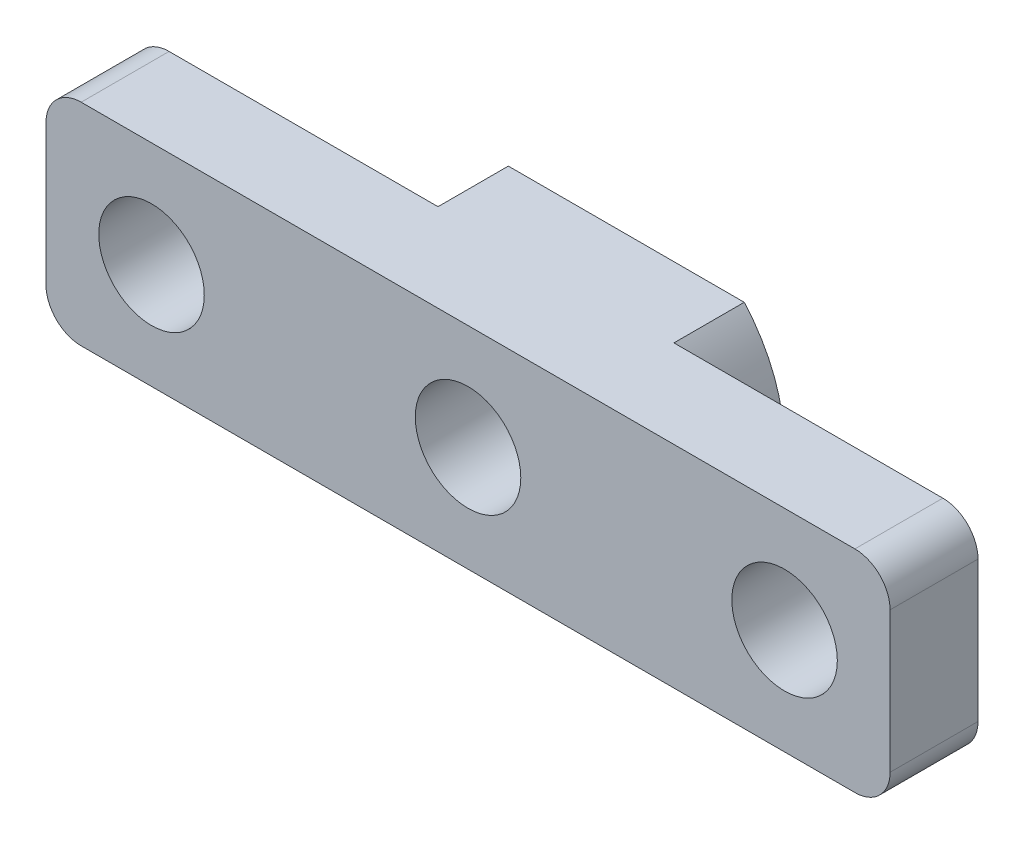
ISO-10303-21;
HEADER;
FILE_DESCRIPTION(('STEP AP214'),'2;1');
FILE_NAME('part.step','',(''),(''),'','','');
FILE_SCHEMA(('AUTOMOTIVE_DESIGN { 1 0 10303 214 1 1 1 1 }'));
ENDSEC;
DATA;
#1=APPLICATION_CONTEXT('core data for automotive mechanical design processes');
#2=APPLICATION_PROTOCOL_DEFINITION('international standard','automotive_design',2000,#1);
#3=PRODUCT_CONTEXT('',#1,'mechanical');
#4=PRODUCT('Part','Part','',(#3));
#5=PRODUCT_RELATED_PRODUCT_CATEGORY('part','',(#4));
#6=PRODUCT_DEFINITION_FORMATION('','',#4);
#7=PRODUCT_DEFINITION_CONTEXT('part definition',#1,'design');
#8=PRODUCT_DEFINITION('design','',#6,#7);
#9=PRODUCT_DEFINITION_SHAPE('','',#8);
#10=(LENGTH_UNIT() NAMED_UNIT(*) SI_UNIT(.MILLI.,.METRE.));
#11=(NAMED_UNIT(*) PLANE_ANGLE_UNIT() SI_UNIT($,.RADIAN.));
#12=(NAMED_UNIT(*) SI_UNIT($,.STERADIAN.) SOLID_ANGLE_UNIT());
#13=UNCERTAINTY_MEASURE_WITH_UNIT(LENGTH_MEASURE(1.E-05),#10,'distance_accuracy_value','');
#14=(GEOMETRIC_REPRESENTATION_CONTEXT(3) GLOBAL_UNCERTAINTY_ASSIGNED_CONTEXT((#13)) GLOBAL_UNIT_ASSIGNED_CONTEXT((#10,
#11,#12)) REPRESENTATION_CONTEXT('',''));
#15=CARTESIAN_POINT('',(0.,0.,0.));
#16=DIRECTION('',(0.,0.,1.));
#17=DIRECTION('',(1.,0.,0.));
#18=AXIS2_PLACEMENT_3D('',#15,#16,#17);
#19=CARTESIAN_POINT('',(0.,0.,0.));
#20=DIRECTION('',(0.,0.,1.));
#21=DIRECTION('',(1.,0.,0.));
#22=AXIS2_PLACEMENT_3D('',#19,#20,#21);
#23=PLANE('',#22);
#24=CARTESIAN_POINT('',(9.,0.,0.));
#25=DIRECTION('',(0.,0.,-1.));
#26=DIRECTION('',(-1.,0.,0.));
#27=AXIS2_PLACEMENT_3D('',#24,#25,#26);
#28=CIRCLE('',#27,4.5);
#29=CARTESIAN_POINT('',(12.3541019662497,3.,0.));
#30=VERTEX_POINT('',#29);
#31=CARTESIAN_POINT('',(12.3541019662497,-3.,0.));
#32=VERTEX_POINT('',#31);
#33=EDGE_CURVE('E153',#30,#32,#28,.T.);
#34=ORIENTED_EDGE('',*,*,#33,.F.);
#35=DIRECTION('',(-1.,0.,0.));
#36=VECTOR('',#35,1.);
#37=CARTESIAN_POINT('',(-3.,3.,0.));
#38=LINE('',#37,#36);
#39=CARTESIAN_POINT('',(20.,3.,0.));
#40=VERTEX_POINT('',#39);
#41=EDGE_CURVE('E187',#40,#30,#38,.T.);
#42=ORIENTED_EDGE('',*,*,#41,.F.);
#43=CARTESIAN_POINT('',(20.,2.,0.));
#44=DIRECTION('',(0.,0.,1.));
#45=DIRECTION('',(1.,0.,0.));
#46=AXIS2_PLACEMENT_3D('',#43,#44,#45);
#47=CIRCLE('',#46,1.);
#48=CARTESIAN_POINT('',(21.,2.,0.));
#49=VERTEX_POINT('',#48);
#50=EDGE_CURVE('E237',#40,#49,#47,.F.);
#51=ORIENTED_EDGE('',*,*,#50,.T.);
#52=DIRECTION('',(0.,1.,0.));
#53=VECTOR('',#52,1.);
#54=CARTESIAN_POINT('',(21.,3.,0.));
#55=LINE('',#54,#53);
#56=CARTESIAN_POINT('',(21.,-2.,0.));
#57=VERTEX_POINT('',#56);
#58=EDGE_CURVE('E205',#57,#49,#55,.T.);
#59=ORIENTED_EDGE('',*,*,#58,.F.);
#60=CARTESIAN_POINT('',(20.,-2.,0.));
#61=DIRECTION('',(0.,0.,1.));
#62=DIRECTION('',(1.,0.,0.));
#63=AXIS2_PLACEMENT_3D('',#60,#61,#62);
#64=CIRCLE('',#63,1.);
#65=CARTESIAN_POINT('',(20.,-3.,0.));
#66=VERTEX_POINT('',#65);
#67=EDGE_CURVE('E234',#57,#66,#64,.F.);
#68=ORIENTED_EDGE('',*,*,#67,.T.);
#69=DIRECTION('',(1.,0.,0.));
#70=VECTOR('',#69,1.);
#71=CARTESIAN_POINT('',(-3.,-3.,0.));
#72=LINE('',#71,#70);
#73=EDGE_CURVE('E55',#32,#66,#72,.T.);
#74=ORIENTED_EDGE('',*,*,#73,.F.);
#75=EDGE_LOOP('',(#34,#42,#51,#59,#68,#74));
#76=FACE_BOUND('',#75,.T.);
#77=CARTESIAN_POINT('',(18.,0.,0.));
#78=DIRECTION('',(0.,0.,1.));
#79=DIRECTION('',(1.,0.,0.));
#80=AXIS2_PLACEMENT_3D('',#77,#78,#79);
#81=CIRCLE('',#80,1.5);
#82=CARTESIAN_POINT('',(19.5,0.,0.));
#83=VERTEX_POINT('',#82);
#84=EDGE_CURVE('E155',#83,#83,#81,.T.);
#85=ORIENTED_EDGE('',*,*,#84,.T.);
#86=EDGE_LOOP('',(#85));
#87=FACE_BOUND('',#86,.T.);
#88=ADVANCED_FACE('F39',(#76,#87),#23,.F.);
#89=CARTESIAN_POINT('',(0.,0.,2.5));
#90=DIRECTION('',(0.,0.,1.));
#91=DIRECTION('',(1.,0.,0.));
#92=AXIS2_PLACEMENT_3D('',#89,#90,#91);
#93=PLANE('',#92);
#94=CARTESIAN_POINT('',(9.,0.,2.5));
#95=DIRECTION('',(0.,0.,1.));
#96=DIRECTION('',(1.,0.,0.));
#97=AXIS2_PLACEMENT_3D('',#94,#95,#96);
#98=CIRCLE('',#97,1.5);
#99=CARTESIAN_POINT('',(10.5,0.,2.5));
#100=VERTEX_POINT('',#99);
#101=EDGE_CURVE('E168',#100,#100,#98,.T.);
#102=ORIENTED_EDGE('',*,*,#101,.F.);
#103=EDGE_LOOP('',(#102));
#104=FACE_BOUND('',#103,.T.);
#105=DIRECTION('',(0.,1.,0.));
#106=VECTOR('',#105,1.);
#107=CARTESIAN_POINT('',(21.,3.,2.5));
#108=LINE('',#107,#106);
#109=CARTESIAN_POINT('',(21.,-2.,2.5));
#110=VERTEX_POINT('',#109);
#111=CARTESIAN_POINT('',(21.,2.,2.5));
#112=VERTEX_POINT('',#111);
#113=EDGE_CURVE('E191',#110,#112,#108,.T.);
#114=ORIENTED_EDGE('',*,*,#113,.T.);
#115=CARTESIAN_POINT('',(20.,2.,2.5));
#116=DIRECTION('',(0.,0.,1.));
#117=DIRECTION('',(1.,0.,0.));
#118=AXIS2_PLACEMENT_3D('',#115,#116,#117);
#119=CIRCLE('',#118,1.);
#120=CARTESIAN_POINT('',(20.,3.,2.5));
#121=VERTEX_POINT('',#120);
#122=EDGE_CURVE('E253',#112,#121,#119,.T.);
#123=ORIENTED_EDGE('',*,*,#122,.T.);
#124=DIRECTION('',(-1.,0.,0.));
#125=VECTOR('',#124,1.);
#126=CARTESIAN_POINT('',(-3.,3.,2.5));
#127=LINE('',#126,#125);
#128=CARTESIAN_POINT('',(-2.,3.,2.5));
#129=VERTEX_POINT('',#128);
#130=EDGE_CURVE('E195',#121,#129,#127,.T.);
#131=ORIENTED_EDGE('',*,*,#130,.T.);
#132=CARTESIAN_POINT('',(-2.,2.,2.5));
#133=DIRECTION('',(0.,0.,1.));
#134=DIRECTION('',(1.,0.,0.));
#135=AXIS2_PLACEMENT_3D('',#132,#133,#134);
#136=CIRCLE('',#135,1.);
#137=CARTESIAN_POINT('',(-3.,2.,2.5));
#138=VERTEX_POINT('',#137);
#139=EDGE_CURVE('E224',#129,#138,#136,.T.);
#140=ORIENTED_EDGE('',*,*,#139,.T.);
#141=DIRECTION('',(0.,-1.,0.));
#142=VECTOR('',#141,1.);
#143=CARTESIAN_POINT('',(-3.,3.,2.5));
#144=LINE('',#143,#142);
#145=CARTESIAN_POINT('',(-3.,-2.,2.5));
#146=VERTEX_POINT('',#145);
#147=EDGE_CURVE('E182',#138,#146,#144,.T.);
#148=ORIENTED_EDGE('',*,*,#147,.T.);
#149=CARTESIAN_POINT('',(-2.,-2.,2.5));
#150=DIRECTION('',(0.,0.,1.));
#151=DIRECTION('',(1.,0.,0.));
#152=AXIS2_PLACEMENT_3D('',#149,#150,#151);
#153=CIRCLE('',#152,1.);
#154=CARTESIAN_POINT('',(-2.,-3.,2.5));
#155=VERTEX_POINT('',#154);
#156=EDGE_CURVE('E247',#146,#155,#153,.T.);
#157=ORIENTED_EDGE('',*,*,#156,.T.);
#158=DIRECTION('',(1.,0.,0.));
#159=VECTOR('',#158,1.);
#160=CARTESIAN_POINT('',(-3.,-3.,2.5));
#161=LINE('',#160,#159);
#162=CARTESIAN_POINT('',(20.,-3.,2.5));
#163=VERTEX_POINT('',#162);
#164=EDGE_CURVE('E186',#155,#163,#161,.T.);
#165=ORIENTED_EDGE('',*,*,#164,.T.);
#166=CARTESIAN_POINT('',(20.,-2.,2.5));
#167=DIRECTION('',(0.,0.,1.));
#168=DIRECTION('',(1.,0.,0.));
#169=AXIS2_PLACEMENT_3D('',#166,#167,#168);
#170=CIRCLE('',#169,1.);
#171=EDGE_CURVE('E250',#163,#110,#170,.T.);
#172=ORIENTED_EDGE('',*,*,#171,.T.);
#173=EDGE_LOOP('',(#114,#123,#131,#140,#148,#157,#165,#172));
#174=FACE_BOUND('',#173,.T.);
#175=CARTESIAN_POINT('',(0.,0.,2.5));
#176=DIRECTION('',(0.,0.,1.));
#177=DIRECTION('',(1.,0.,0.));
#178=AXIS2_PLACEMENT_3D('',#175,#176,#177);
#179=CIRCLE('',#178,1.5);
#180=CARTESIAN_POINT('',(1.5,0.,2.5));
#181=VERTEX_POINT('',#180);
#182=EDGE_CURVE('E174',#181,#181,#179,.T.);
#183=ORIENTED_EDGE('',*,*,#182,.F.);
#184=EDGE_LOOP('',(#183));
#185=FACE_BOUND('',#184,.T.);
#186=CARTESIAN_POINT('',(18.,0.,2.5));
#187=DIRECTION('',(0.,0.,1.));
#188=DIRECTION('',(1.,0.,0.));
#189=AXIS2_PLACEMENT_3D('',#186,#187,#188);
#190=CIRCLE('',#189,1.5);
#191=CARTESIAN_POINT('',(19.5,0.,2.5));
#192=VERTEX_POINT('',#191);
#193=EDGE_CURVE('E160',#192,#192,#190,.T.);
#194=ORIENTED_EDGE('',*,*,#193,.F.);
#195=EDGE_LOOP('',(#194));
#196=FACE_BOUND('',#195,.T.);
#197=ADVANCED_FACE('F266',(#104,#174,#185,#196),#93,.T.);
#198=CARTESIAN_POINT('',(9.,0.,0.));
#199=DIRECTION('',(0.,0.,-1.));
#200=DIRECTION('',(-1.,0.,0.));
#201=AXIS2_PLACEMENT_3D('',#198,#199,#200);
#202=CIRCLE('',#201,4.5);
#203=CARTESIAN_POINT('',(5.64589803375031,-3.,0.));
#204=VERTEX_POINT('',#203);
#205=CARTESIAN_POINT('',(5.64589803375031,3.,0.));
#206=VERTEX_POINT('',#205);
#207=EDGE_CURVE('E63',#204,#206,#202,.T.);
#208=ORIENTED_EDGE('',*,*,#207,.F.);
#209=CARTESIAN_POINT('',(-2.,-3.,0.));
#210=VERTEX_POINT('',#209);
#211=EDGE_CURVE('E202',#210,#204,#72,.T.);
#212=ORIENTED_EDGE('',*,*,#211,.F.);
#213=CARTESIAN_POINT('',(-2.,-2.,0.));
#214=DIRECTION('',(0.,0.,1.));
#215=DIRECTION('',(1.,0.,0.));
#216=AXIS2_PLACEMENT_3D('',#213,#214,#215);
#217=CIRCLE('',#216,1.);
#218=CARTESIAN_POINT('',(-3.,-2.,0.));
#219=VERTEX_POINT('',#218);
#220=EDGE_CURVE('E231',#210,#219,#217,.F.);
#221=ORIENTED_EDGE('',*,*,#220,.T.);
#222=DIRECTION('',(0.,-1.,0.));
#223=VECTOR('',#222,1.);
#224=CARTESIAN_POINT('',(-3.,3.,0.));
#225=LINE('',#224,#223);
#226=CARTESIAN_POINT('',(-3.,2.,0.));
#227=VERTEX_POINT('',#226);
#228=EDGE_CURVE('E178',#227,#219,#225,.T.);
#229=ORIENTED_EDGE('',*,*,#228,.F.);
#230=CARTESIAN_POINT('',(-2.,2.,0.));
#231=DIRECTION('',(0.,0.,1.));
#232=DIRECTION('',(1.,0.,0.));
#233=AXIS2_PLACEMENT_3D('',#230,#231,#232);
#234=CIRCLE('',#233,1.);
#235=CARTESIAN_POINT('',(-2.,3.,0.));
#236=VERTEX_POINT('',#235);
#237=EDGE_CURVE('E216',#227,#236,#234,.F.);
#238=ORIENTED_EDGE('',*,*,#237,.T.);
#239=EDGE_CURVE('E209',#206,#236,#38,.T.);
#240=ORIENTED_EDGE('',*,*,#239,.F.);
#241=EDGE_LOOP('',(#208,#212,#221,#229,#238,#240));
#242=FACE_BOUND('',#241,.T.);
#243=CARTESIAN_POINT('',(0.,0.,0.));
#244=DIRECTION('',(0.,0.,1.));
#245=DIRECTION('',(1.,0.,0.));
#246=AXIS2_PLACEMENT_3D('',#243,#244,#245);
#247=CIRCLE('',#246,1.5);
#248=CARTESIAN_POINT('',(1.5,0.,0.));
#249=VERTEX_POINT('',#248);
#250=EDGE_CURVE('E173',#249,#249,#247,.T.);
#251=ORIENTED_EDGE('',*,*,#250,.T.);
#252=EDGE_LOOP('',(#251));
#253=FACE_BOUND('',#252,.T.);
#254=ADVANCED_FACE('F295',(#242,#253),#23,.F.);
#255=CARTESIAN_POINT('',(-3.,3.,2.5));
#256=DIRECTION('',(1.,0.,0.));
#257=DIRECTION('',(0.,1.,0.));
#258=AXIS2_PLACEMENT_3D('',#255,#256,#257);
#259=PLANE('',#258);
#260=ORIENTED_EDGE('',*,*,#228,.T.);
#261=DIRECTION('',(0.,0.,-1.));
#262=VECTOR('',#261,1.);
#263=CARTESIAN_POINT('',(-3.,-2.,2.5));
#264=LINE('',#263,#262);
#265=EDGE_CURVE('E11',#219,#146,#264,.F.);
#266=ORIENTED_EDGE('',*,*,#265,.T.);
#267=ORIENTED_EDGE('',*,*,#147,.F.);
#268=DIRECTION('',(0.,0.,-1.));
#269=VECTOR('',#268,1.);
#270=CARTESIAN_POINT('',(-3.,2.,2.5));
#271=LINE('',#270,#269);
#272=EDGE_CURVE('E198',#138,#227,#271,.T.);
#273=ORIENTED_EDGE('',*,*,#272,.T.);
#274=EDGE_LOOP('',(#260,#266,#267,#273));
#275=FACE_BOUND('',#274,.T.);
#276=ADVANCED_FACE('F291',(#275),#259,.F.);
#277=CARTESIAN_POINT('',(-3.,-3.,2.5));
#278=DIRECTION('',(0.,1.,0.));
#279=DIRECTION('',(0.,0.,1.));
#280=AXIS2_PLACEMENT_3D('',#277,#278,#279);
#281=PLANE('',#280);
#282=ORIENTED_EDGE('',*,*,#211,.T.);
#283=DIRECTION('',(0.,0.,1.));
#284=VECTOR('',#283,1.);
#285=CARTESIAN_POINT('',(5.64589803375032,-3.,-2.));
#286=LINE('',#285,#284);
#287=CARTESIAN_POINT('',(5.64589803375032,-3.,-2.));
#288=VERTEX_POINT('',#287);
#289=EDGE_CURVE('E135',#288,#204,#286,.T.);
#290=ORIENTED_EDGE('',*,*,#289,.F.);
#291=DIRECTION('',(-1.,0.,0.));
#292=VECTOR('',#291,1.);
#293=CARTESIAN_POINT('',(5.64589803375031,-3.,-2.));
#294=LINE('',#293,#292);
#295=CARTESIAN_POINT('',(12.3541019662497,-3.,-2.));
#296=VERTEX_POINT('',#295);
#297=EDGE_CURVE('E128',#296,#288,#294,.T.);
#298=ORIENTED_EDGE('',*,*,#297,.F.);
#299=DIRECTION('',(0.,0.,1.));
#300=VECTOR('',#299,1.);
#301=CARTESIAN_POINT('',(12.3541019662497,-3.,-2.));
#302=LINE('',#301,#300);
#303=EDGE_CURVE('E132',#296,#32,#302,.T.);
#304=ORIENTED_EDGE('',*,*,#303,.T.);
#305=ORIENTED_EDGE('',*,*,#73,.T.);
#306=DIRECTION('',(0.,0.,-1.));
#307=VECTOR('',#306,1.);
#308=CARTESIAN_POINT('',(20.,-3.,2.5));
#309=LINE('',#308,#307);
#310=EDGE_CURVE('E48',#66,#163,#309,.F.);
#311=ORIENTED_EDGE('',*,*,#310,.T.);
#312=ORIENTED_EDGE('',*,*,#164,.F.);
#313=DIRECTION('',(0.,0.,-1.));
#314=VECTOR('',#313,1.);
#315=CARTESIAN_POINT('',(-2.,-3.,2.5));
#316=LINE('',#315,#314);
#317=EDGE_CURVE('E256',#155,#210,#316,.T.);
#318=ORIENTED_EDGE('',*,*,#317,.T.);
#319=EDGE_LOOP('',(#282,#290,#298,#304,#305,#311,#312,#318));
#320=FACE_BOUND('',#319,.T.);
#321=ADVANCED_FACE('F130',(#320),#281,.F.);
#322=CARTESIAN_POINT('',(21.,3.,2.5));
#323=DIRECTION('',(-1.,0.,0.));
#324=DIRECTION('',(0.,0.,1.));
#325=AXIS2_PLACEMENT_3D('',#322,#323,#324);
#326=PLANE('',#325);
#327=ORIENTED_EDGE('',*,*,#58,.T.);
#328=DIRECTION('',(0.,0.,-1.));
#329=VECTOR('',#328,1.);
#330=CARTESIAN_POINT('',(21.,2.,2.5));
#331=LINE('',#330,#329);
#332=EDGE_CURVE('E244',#49,#112,#331,.F.);
#333=ORIENTED_EDGE('',*,*,#332,.T.);
#334=ORIENTED_EDGE('',*,*,#113,.F.);
#335=DIRECTION('',(0.,0.,-1.));
#336=VECTOR('',#335,1.);
#337=CARTESIAN_POINT('',(21.,-2.,2.5));
#338=LINE('',#337,#336);
#339=EDGE_CURVE('E240',#110,#57,#338,.T.);
#340=ORIENTED_EDGE('',*,*,#339,.T.);
#341=EDGE_LOOP('',(#327,#333,#334,#340));
#342=FACE_BOUND('',#341,.T.);
#343=ADVANCED_FACE('F274',(#342),#326,.F.);
#344=CARTESIAN_POINT('',(-3.,3.,2.5));
#345=DIRECTION('',(0.,-1.,0.));
#346=DIRECTION('',(0.,0.,-1.));
#347=AXIS2_PLACEMENT_3D('',#344,#345,#346);
#348=PLANE('',#347);
#349=ORIENTED_EDGE('',*,*,#130,.F.);
#350=DIRECTION('',(0.,0.,-1.));
#351=VECTOR('',#350,1.);
#352=CARTESIAN_POINT('',(20.,3.,2.5));
#353=LINE('',#352,#351);
#354=EDGE_CURVE('E227',#121,#40,#353,.T.);
#355=ORIENTED_EDGE('',*,*,#354,.T.);
#356=ORIENTED_EDGE('',*,*,#41,.T.);
#357=DIRECTION('',(0.,0.,1.));
#358=VECTOR('',#357,1.);
#359=CARTESIAN_POINT('',(12.3541019662497,3.,-2.));
#360=LINE('',#359,#358);
#361=CARTESIAN_POINT('',(12.3541019662497,3.,-2.));
#362=VERTEX_POINT('',#361);
#363=EDGE_CURVE('E305',#362,#30,#360,.T.);
#364=ORIENTED_EDGE('',*,*,#363,.F.);
#365=DIRECTION('',(1.,0.,0.));
#366=VECTOR('',#365,1.);
#367=CARTESIAN_POINT('',(12.3541019662497,3.,-2.));
#368=LINE('',#367,#366);
#369=CARTESIAN_POINT('',(5.64589803375031,3.,-2.));
#370=VERTEX_POINT('',#369);
#371=EDGE_CURVE('E146',#370,#362,#368,.T.);
#372=ORIENTED_EDGE('',*,*,#371,.F.);
#373=DIRECTION('',(0.,0.,1.));
#374=VECTOR('',#373,1.);
#375=CARTESIAN_POINT('',(5.64589803375031,3.,-2.));
#376=LINE('',#375,#374);
#377=EDGE_CURVE('E162',#370,#206,#376,.T.);
#378=ORIENTED_EDGE('',*,*,#377,.T.);
#379=ORIENTED_EDGE('',*,*,#239,.T.);
#380=DIRECTION('',(0.,0.,-1.));
#381=VECTOR('',#380,1.);
#382=CARTESIAN_POINT('',(-2.,3.,2.5));
#383=LINE('',#382,#381);
#384=EDGE_CURVE('E220',#236,#129,#383,.F.);
#385=ORIENTED_EDGE('',*,*,#384,.T.);
#386=EDGE_LOOP('',(#349,#355,#356,#364,#372,#378,#379,#385));
#387=FACE_BOUND('',#386,.T.);
#388=ADVANCED_FACE('F284',(#387),#348,.F.);
#389=CARTESIAN_POINT('',(0.,0.,2.5));
#390=DIRECTION('',(0.,0.,-1.));
#391=DIRECTION('',(-1.,0.,0.));
#392=AXIS2_PLACEMENT_3D('',#389,#390,#391);
#393=CYLINDRICAL_SURFACE('',#392,1.5);
#394=ORIENTED_EDGE('',*,*,#182,.T.);
#395=EDGE_LOOP('',(#394));
#396=FACE_BOUND('',#395,.T.);
#397=ORIENTED_EDGE('',*,*,#250,.F.);
#398=EDGE_LOOP('',(#397));
#399=FACE_BOUND('',#398,.T.);
#400=ADVANCED_FACE('F378',(#396,#399),#393,.F.);
#401=CARTESIAN_POINT('',(9.,0.,2.5));
#402=DIRECTION('',(0.,0.,-1.));
#403=DIRECTION('',(-1.,0.,0.));
#404=AXIS2_PLACEMENT_3D('',#401,#402,#403);
#405=CYLINDRICAL_SURFACE('',#404,1.5);
#406=ORIENTED_EDGE('',*,*,#101,.T.);
#407=EDGE_LOOP('',(#406));
#408=FACE_BOUND('',#407,.T.);
#409=CARTESIAN_POINT('',(9.,0.,-2.));
#410=DIRECTION('',(0.,0.,-1.));
#411=DIRECTION('',(-1.,0.,0.));
#412=AXIS2_PLACEMENT_3D('',#409,#410,#411);
#413=CIRCLE('',#412,1.5);
#414=CARTESIAN_POINT('',(7.5,0.,-2.));
#415=VERTEX_POINT('',#414);
#416=EDGE_CURVE('E310',#415,#415,#413,.T.);
#417=ORIENTED_EDGE('',*,*,#416,.T.);
#418=EDGE_LOOP('',(#417));
#419=FACE_BOUND('',#418,.T.);
#420=ADVANCED_FACE('F322',(#408,#419),#405,.F.);
#421=CARTESIAN_POINT('',(18.,0.,2.5));
#422=DIRECTION('',(0.,0.,-1.));
#423=DIRECTION('',(-1.,0.,0.));
#424=AXIS2_PLACEMENT_3D('',#421,#422,#423);
#425=CYLINDRICAL_SURFACE('',#424,1.5);
#426=ORIENTED_EDGE('',*,*,#193,.T.);
#427=EDGE_LOOP('',(#426));
#428=FACE_BOUND('',#427,.T.);
#429=ORIENTED_EDGE('',*,*,#84,.F.);
#430=EDGE_LOOP('',(#429));
#431=FACE_BOUND('',#430,.T.);
#432=ADVANCED_FACE('F356',(#428,#431),#425,.F.);
#433=CARTESIAN_POINT('',(-2.,2.,2.5));
#434=DIRECTION('',(0.,0.,-1.));
#435=DIRECTION('',(-1.,0.,0.));
#436=AXIS2_PLACEMENT_3D('',#433,#434,#435);
#437=CYLINDRICAL_SURFACE('',#436,1.);
#438=ORIENTED_EDGE('',*,*,#139,.F.);
#439=ORIENTED_EDGE('',*,*,#384,.F.);
#440=ORIENTED_EDGE('',*,*,#237,.F.);
#441=ORIENTED_EDGE('',*,*,#272,.F.);
#442=EDGE_LOOP('',(#438,#439,#440,#441));
#443=FACE_BOUND('',#442,.T.);
#444=ADVANCED_FACE('F294',(#443),#437,.T.);
#445=CARTESIAN_POINT('',(20.,2.,2.5));
#446=DIRECTION('',(0.,0.,-1.));
#447=DIRECTION('',(-1.,0.,0.));
#448=AXIS2_PLACEMENT_3D('',#445,#446,#447);
#449=CYLINDRICAL_SURFACE('',#448,1.);
#450=ORIENTED_EDGE('',*,*,#122,.F.);
#451=ORIENTED_EDGE('',*,*,#332,.F.);
#452=ORIENTED_EDGE('',*,*,#50,.F.);
#453=ORIENTED_EDGE('',*,*,#354,.F.);
#454=EDGE_LOOP('',(#450,#451,#452,#453));
#455=FACE_BOUND('',#454,.T.);
#456=ADVANCED_FACE('F281',(#455),#449,.T.);
#457=CARTESIAN_POINT('',(20.,-2.,2.5));
#458=DIRECTION('',(0.,0.,-1.));
#459=DIRECTION('',(-1.,0.,0.));
#460=AXIS2_PLACEMENT_3D('',#457,#458,#459);
#461=CYLINDRICAL_SURFACE('',#460,1.);
#462=ORIENTED_EDGE('',*,*,#171,.F.);
#463=ORIENTED_EDGE('',*,*,#310,.F.);
#464=ORIENTED_EDGE('',*,*,#67,.F.);
#465=ORIENTED_EDGE('',*,*,#339,.F.);
#466=EDGE_LOOP('',(#462,#463,#464,#465));
#467=FACE_BOUND('',#466,.T.);
#468=ADVANCED_FACE('F271',(#467),#461,.T.);
#469=CARTESIAN_POINT('',(-2.,-2.,2.5));
#470=DIRECTION('',(0.,0.,-1.));
#471=DIRECTION('',(-1.,0.,0.));
#472=AXIS2_PLACEMENT_3D('',#469,#470,#471);
#473=CYLINDRICAL_SURFACE('',#472,1.);
#474=ORIENTED_EDGE('',*,*,#156,.F.);
#475=ORIENTED_EDGE('',*,*,#265,.F.);
#476=ORIENTED_EDGE('',*,*,#220,.F.);
#477=ORIENTED_EDGE('',*,*,#317,.F.);
#478=EDGE_LOOP('',(#474,#475,#476,#477));
#479=FACE_BOUND('',#478,.T.);
#480=ADVANCED_FACE('F41',(#479),#473,.T.);
#481=CARTESIAN_POINT('',(9.,0.,-2.));
#482=DIRECTION('',(0.,0.,-1.));
#483=DIRECTION('',(-1.,0.,0.));
#484=AXIS2_PLACEMENT_3D('',#481,#482,#483);
#485=PLANE('',#484);
#486=CARTESIAN_POINT('',(9.,0.,-2.));
#487=DIRECTION('',(0.,0.,-1.));
#488=DIRECTION('',(-1.,0.,0.));
#489=AXIS2_PLACEMENT_3D('',#486,#487,#488);
#490=CIRCLE('',#489,4.5);
#491=EDGE_CURVE('E140',#362,#296,#490,.T.);
#492=ORIENTED_EDGE('',*,*,#491,.T.);
#493=ORIENTED_EDGE('',*,*,#297,.T.);
#494=CARTESIAN_POINT('',(9.,0.,-2.));
#495=DIRECTION('',(0.,0.,-1.));
#496=DIRECTION('',(-1.,0.,0.));
#497=AXIS2_PLACEMENT_3D('',#494,#495,#496);
#498=CIRCLE('',#497,4.5);
#499=EDGE_CURVE('E139',#288,#370,#498,.T.);
#500=ORIENTED_EDGE('',*,*,#499,.T.);
#501=ORIENTED_EDGE('',*,*,#371,.T.);
#502=EDGE_LOOP('',(#492,#493,#500,#501));
#503=FACE_BOUND('',#502,.T.);
#504=ORIENTED_EDGE('',*,*,#416,.F.);
#505=EDGE_LOOP('',(#504));
#506=FACE_BOUND('',#505,.T.);
#507=ADVANCED_FACE('F143',(#503,#506),#485,.T.);
#508=CARTESIAN_POINT('',(9.,0.,-2.));
#509=DIRECTION('',(0.,0.,1.));
#510=DIRECTION('',(1.,0.,0.));
#511=AXIS2_PLACEMENT_3D('',#508,#509,#510);
#512=CYLINDRICAL_SURFACE('',#511,4.5);
#513=ORIENTED_EDGE('',*,*,#33,.T.);
#514=ORIENTED_EDGE('',*,*,#303,.F.);
#515=ORIENTED_EDGE('',*,*,#491,.F.);
#516=ORIENTED_EDGE('',*,*,#363,.T.);
#517=EDGE_LOOP('',(#513,#514,#515,#516));
#518=FACE_BOUND('',#517,.T.);
#519=ADVANCED_FACE('F152',(#518),#512,.T.);
#520=CARTESIAN_POINT('',(9.,0.,-2.));
#521=DIRECTION('',(0.,0.,1.));
#522=DIRECTION('',(1.,0.,0.));
#523=AXIS2_PLACEMENT_3D('',#520,#521,#522);
#524=CYLINDRICAL_SURFACE('',#523,4.5);
#525=ORIENTED_EDGE('',*,*,#207,.T.);
#526=ORIENTED_EDGE('',*,*,#377,.F.);
#527=ORIENTED_EDGE('',*,*,#499,.F.);
#528=ORIENTED_EDGE('',*,*,#289,.T.);
#529=EDGE_LOOP('',(#525,#526,#527,#528));
#530=FACE_BOUND('',#529,.T.);
#531=ADVANCED_FACE('F299',(#530),#524,.T.);
#532=CLOSED_SHELL('',(#88,#197,#254,#276,#321,#343,#388,#400,#420,#432,#444,#456,#468,#480,#507,
#519,#531));
#533=MANIFOLD_SOLID_BREP('B2',#532);
#534=ADVANCED_BREP_SHAPE_REPRESENTATION('',(#18,#533),#14);
#535=SHAPE_DEFINITION_REPRESENTATION(#9,#534);
ENDSEC;
END-ISO-10303-21;
